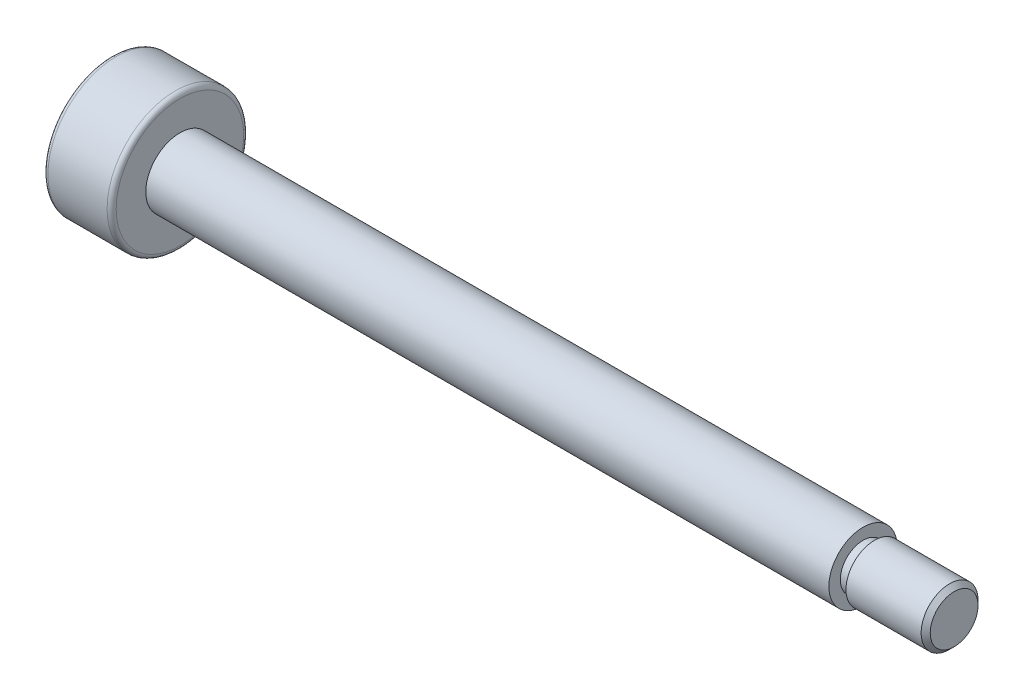
ISO-10303-21;
HEADER;
FILE_DESCRIPTION(('STEP AP214'),'2;1');
FILE_NAME('part.step','',(''),(''),'','','');
FILE_SCHEMA(('AUTOMOTIVE_DESIGN { 1 0 10303 214 1 1 1 1 }'));
ENDSEC;
DATA;
#1=APPLICATION_CONTEXT('core data for automotive mechanical design processes');
#2=APPLICATION_PROTOCOL_DEFINITION('international standard','automotive_design',2000,#1);
#3=PRODUCT_CONTEXT('',#1,'mechanical');
#4=PRODUCT('Part','Part','',(#3));
#5=PRODUCT_RELATED_PRODUCT_CATEGORY('part','',(#4));
#6=PRODUCT_DEFINITION_FORMATION('','',#4);
#7=PRODUCT_DEFINITION_CONTEXT('part definition',#1,'design');
#8=PRODUCT_DEFINITION('design','',#6,#7);
#9=PRODUCT_DEFINITION_SHAPE('','',#8);
#10=(LENGTH_UNIT() NAMED_UNIT(*) SI_UNIT(.MILLI.,.METRE.));
#11=(NAMED_UNIT(*) PLANE_ANGLE_UNIT() SI_UNIT($,.RADIAN.));
#12=(NAMED_UNIT(*) SI_UNIT($,.STERADIAN.) SOLID_ANGLE_UNIT());
#13=UNCERTAINTY_MEASURE_WITH_UNIT(LENGTH_MEASURE(1.E-05),#10,'distance_accuracy_value','');
#14=(GEOMETRIC_REPRESENTATION_CONTEXT(3) GLOBAL_UNCERTAINTY_ASSIGNED_CONTEXT((#13)) GLOBAL_UNIT_ASSIGNED_CONTEXT((#10,
#11,#12)) REPRESENTATION_CONTEXT('',''));
#15=CARTESIAN_POINT('',(0.,0.,0.));
#16=DIRECTION('',(0.,0.,1.));
#17=DIRECTION('',(1.,0.,0.));
#18=AXIS2_PLACEMENT_3D('',#15,#16,#17);
#19=CARTESIAN_POINT('',(-18.5,0.,0.));
#20=DIRECTION('',(1.,0.,0.));
#21=DIRECTION('',(0.,0.,-1.));
#22=AXIS2_PLACEMENT_3D('',#19,#20,#21);
#23=PLANE('',#22);
#24=DIRECTION('',(0.,0.866025403784438,-0.5));
#25=VECTOR('',#24,1.);
#26=CARTESIAN_POINT('',(-18.5,0.,1.73205080756888));
#27=LINE('',#26,#25);
#28=CARTESIAN_POINT('',(-18.5,0.,1.73205080756888));
#29=VERTEX_POINT('',#28);
#30=CARTESIAN_POINT('',(-18.5,1.5,0.866025403784438));
#31=VERTEX_POINT('',#30);
#32=EDGE_CURVE('E127',#29,#31,#27,.T.);
#33=ORIENTED_EDGE('',*,*,#32,.F.);
#34=DIRECTION('',(0.,0.866025403784439,0.5));
#35=VECTOR('',#34,1.);
#36=CARTESIAN_POINT('',(-18.5,-1.5,0.866025403784438));
#37=LINE('',#36,#35);
#38=CARTESIAN_POINT('',(-18.5,-1.5,0.866025403784438));
#39=VERTEX_POINT('',#38);
#40=EDGE_CURVE('E53',#39,#29,#37,.T.);
#41=ORIENTED_EDGE('',*,*,#40,.F.);
#42=DIRECTION('',(0.,0.,1.));
#43=VECTOR('',#42,1.);
#44=CARTESIAN_POINT('',(-18.5,-1.5,-0.866025403784438));
#45=LINE('',#44,#43);
#46=CARTESIAN_POINT('',(-18.5,-1.5,-0.866025403784438));
#47=VERTEX_POINT('',#46);
#48=EDGE_CURVE('E136',#47,#39,#45,.T.);
#49=ORIENTED_EDGE('',*,*,#48,.F.);
#50=DIRECTION('',(0.,-0.866025403784438,0.5));
#51=VECTOR('',#50,1.);
#52=CARTESIAN_POINT('',(-18.5,0.,-1.73205080756888));
#53=LINE('',#52,#51);
#54=CARTESIAN_POINT('',(-18.5,0.,-1.73205080756888));
#55=VERTEX_POINT('',#54);
#56=EDGE_CURVE('E134',#55,#47,#53,.T.);
#57=ORIENTED_EDGE('',*,*,#56,.F.);
#58=DIRECTION('',(0.,-0.866025403784439,-0.5));
#59=VECTOR('',#58,1.);
#60=CARTESIAN_POINT('',(-18.5,1.5,-0.866025403784438));
#61=LINE('',#60,#59);
#62=CARTESIAN_POINT('',(-18.5,1.5,-0.866025403784438));
#63=VERTEX_POINT('',#62);
#64=EDGE_CURVE('E101',#63,#55,#61,.T.);
#65=ORIENTED_EDGE('',*,*,#64,.F.);
#66=DIRECTION('',(0.,0.,-1.));
#67=VECTOR('',#66,1.);
#68=CARTESIAN_POINT('',(-18.5,1.5,0.866025403784438));
#69=LINE('',#68,#67);
#70=EDGE_CURVE('E130',#31,#63,#69,.T.);
#71=ORIENTED_EDGE('',*,*,#70,.F.);
#72=EDGE_LOOP('',(#33,#41,#49,#57,#65,#71));
#73=FACE_BOUND('',#72,.T.);
#74=CARTESIAN_POINT('',(-18.5,0.,0.));
#75=DIRECTION('',(1.,0.,0.));
#76=DIRECTION('',(0.,0.,-1.));
#77=AXIS2_PLACEMENT_3D('',#74,#75,#76);
#78=CIRCLE('',#77,2.8);
#79=CARTESIAN_POINT('',(-18.5,0.,-2.8));
#80=VERTEX_POINT('',#79);
#81=EDGE_CURVE('E169',#80,#80,#78,.F.);
#82=ORIENTED_EDGE('',*,*,#81,.T.);
#83=EDGE_LOOP('',(#82));
#84=FACE_BOUND('',#83,.T.);
#85=ADVANCED_FACE('F37',(#73,#84),#23,.F.);
#86=CARTESIAN_POINT('',(-18.5,0.,0.));
#87=DIRECTION('',(-1.,0.,0.));
#88=DIRECTION('',(0.,0.,1.));
#89=AXIS2_PLACEMENT_3D('',#86,#87,#88);
#90=CYLINDRICAL_SURFACE('',#89,3.);
#91=CARTESIAN_POINT('',(-15.7,0.,0.));
#92=DIRECTION('',(-1.,0.,0.));
#93=DIRECTION('',(0.,0.,1.));
#94=AXIS2_PLACEMENT_3D('',#91,#92,#93);
#95=CIRCLE('',#94,3.);
#96=CARTESIAN_POINT('',(-15.7,0.,3.));
#97=VERTEX_POINT('',#96);
#98=EDGE_CURVE('E163',#97,#97,#95,.T.);
#99=ORIENTED_EDGE('',*,*,#98,.T.);
#100=EDGE_LOOP('',(#99));
#101=FACE_BOUND('',#100,.T.);
#102=CARTESIAN_POINT('',(-18.3,0.,0.));
#103=DIRECTION('',(1.,0.,0.));
#104=DIRECTION('',(0.,0.,-1.));
#105=AXIS2_PLACEMENT_3D('',#102,#103,#104);
#106=CIRCLE('',#105,3.);
#107=CARTESIAN_POINT('',(-18.3,0.,-3.));
#108=VERTEX_POINT('',#107);
#109=EDGE_CURVE('E160',#108,#108,#106,.T.);
#110=ORIENTED_EDGE('',*,*,#109,.T.);
#111=EDGE_LOOP('',(#110));
#112=FACE_BOUND('',#111,.T.);
#113=ADVANCED_FACE('F191',(#101,#112),#90,.T.);
#114=CARTESIAN_POINT('',(-15.5,3.,0.));
#115=DIRECTION('',(-1.,0.,0.));
#116=DIRECTION('',(0.,0.,1.));
#117=AXIS2_PLACEMENT_3D('',#114,#115,#116);
#118=PLANE('',#117);
#119=CARTESIAN_POINT('',(-15.5,0.,0.));
#120=DIRECTION('',(-1.,0.,0.));
#121=DIRECTION('',(0.,0.,1.));
#122=AXIS2_PLACEMENT_3D('',#119,#120,#121);
#123=CIRCLE('',#122,2.8);
#124=CARTESIAN_POINT('',(-15.5,0.,2.8));
#125=VERTEX_POINT('',#124);
#126=EDGE_CURVE('E166',#125,#125,#123,.F.);
#127=ORIENTED_EDGE('',*,*,#126,.T.);
#128=EDGE_LOOP('',(#127));
#129=FACE_BOUND('',#128,.T.);
#130=CARTESIAN_POINT('',(-15.5,0.,0.));
#131=DIRECTION('',(-1.,0.,0.));
#132=DIRECTION('',(0.,0.,1.));
#133=AXIS2_PLACEMENT_3D('',#130,#131,#132);
#134=CIRCLE('',#133,1.5);
#135=CARTESIAN_POINT('',(-15.5,0.,1.5));
#136=VERTEX_POINT('',#135);
#137=EDGE_CURVE('E157',#136,#136,#134,.T.);
#138=ORIENTED_EDGE('',*,*,#137,.T.);
#139=EDGE_LOOP('',(#138));
#140=FACE_BOUND('',#139,.T.);
#141=ADVANCED_FACE('F197',(#129,#140),#118,.F.);
#142=CARTESIAN_POINT('',(-18.5,0.,0.));
#143=DIRECTION('',(-1.,0.,0.));
#144=DIRECTION('',(0.,0.,1.));
#145=AXIS2_PLACEMENT_3D('',#142,#143,#144);
#146=CYLINDRICAL_SURFACE('',#145,1.5);
#147=ORIENTED_EDGE('',*,*,#137,.F.);
#148=EDGE_LOOP('',(#147));
#149=FACE_BOUND('',#148,.T.);
#150=CARTESIAN_POINT('',(14.5,0.,0.));
#151=DIRECTION('',(-1.,0.,0.));
#152=DIRECTION('',(0.,0.,1.));
#153=AXIS2_PLACEMENT_3D('',#150,#151,#152);
#154=CIRCLE('',#153,1.5);
#155=CARTESIAN_POINT('',(14.5,0.,1.5));
#156=VERTEX_POINT('',#155);
#157=EDGE_CURVE('E154',#156,#156,#154,.T.);
#158=ORIENTED_EDGE('',*,*,#157,.T.);
#159=EDGE_LOOP('',(#158));
#160=FACE_BOUND('',#159,.T.);
#161=ADVANCED_FACE('F231',(#149,#160),#146,.T.);
#162=CARTESIAN_POINT('',(14.5,1.5,0.));
#163=DIRECTION('',(-1.,0.,0.));
#164=DIRECTION('',(0.,0.,1.));
#165=AXIS2_PLACEMENT_3D('',#162,#163,#164);
#166=PLANE('',#165);
#167=ORIENTED_EDGE('',*,*,#157,.F.);
#168=EDGE_LOOP('',(#167));
#169=FACE_BOUND('',#168,.T.);
#170=CARTESIAN_POINT('',(14.5,0.,0.));
#171=DIRECTION('',(-1.,0.,0.));
#172=DIRECTION('',(0.,0.,1.));
#173=AXIS2_PLACEMENT_3D('',#170,#171,#172);
#174=CIRCLE('',#173,1.);
#175=CARTESIAN_POINT('',(14.5,0.,1.));
#176=VERTEX_POINT('',#175);
#177=EDGE_CURVE('E151',#176,#176,#174,.T.);
#178=ORIENTED_EDGE('',*,*,#177,.T.);
#179=EDGE_LOOP('',(#178));
#180=FACE_BOUND('',#179,.T.);
#181=ADVANCED_FACE('F207',(#169,#180),#166,.F.);
#182=CARTESIAN_POINT('',(-15.7,0.,0.));
#183=DIRECTION('',(-1.,0.,0.));
#184=DIRECTION('',(0.,0.,1.));
#185=AXIS2_PLACEMENT_3D('',#182,#183,#184);
#186=TOROIDAL_SURFACE('',#185,2.8,0.2);
#187=ORIENTED_EDGE('',*,*,#126,.F.);
#188=EDGE_LOOP('',(#187));
#189=FACE_BOUND('',#188,.T.);
#190=ORIENTED_EDGE('',*,*,#98,.F.);
#191=EDGE_LOOP('',(#190));
#192=FACE_BOUND('',#191,.T.);
#193=ADVANCED_FACE('F204',(#189,#192),#186,.T.);
#194=CARTESIAN_POINT('',(-18.3,0.,0.));
#195=DIRECTION('',(1.,0.,0.));
#196=DIRECTION('',(0.,0.,-1.));
#197=AXIS2_PLACEMENT_3D('',#194,#195,#196);
#198=TOROIDAL_SURFACE('',#197,2.8,0.2);
#199=ORIENTED_EDGE('',*,*,#109,.F.);
#200=EDGE_LOOP('',(#199));
#201=FACE_BOUND('',#200,.T.);
#202=ORIENTED_EDGE('',*,*,#81,.F.);
#203=EDGE_LOOP('',(#202));
#204=FACE_BOUND('',#203,.T.);
#205=ADVANCED_FACE('F206',(#201,#204),#198,.T.);
#206=CARTESIAN_POINT('',(14.5,0.,0.));
#207=DIRECTION('',(-1.,0.,0.));
#208=DIRECTION('',(0.,0.,1.));
#209=AXIS2_PLACEMENT_3D('',#206,#207,#208);
#210=CYLINDRICAL_SURFACE('',#209,1.);
#211=CARTESIAN_POINT('',(15.,0.,0.));
#212=DIRECTION('',(-1.,0.,0.));
#213=DIRECTION('',(0.,0.,1.));
#214=AXIS2_PLACEMENT_3D('',#211,#212,#213);
#215=CIRCLE('',#214,1.);
#216=CARTESIAN_POINT('',(15.,0.,1.));
#217=VERTEX_POINT('',#216);
#218=EDGE_CURVE('E148',#217,#217,#215,.T.);
#219=ORIENTED_EDGE('',*,*,#218,.T.);
#220=EDGE_LOOP('',(#219));
#221=FACE_BOUND('',#220,.T.);
#222=ORIENTED_EDGE('',*,*,#177,.F.);
#223=EDGE_LOOP('',(#222));
#224=FACE_BOUND('',#223,.T.);
#225=ADVANCED_FACE('F210',(#221,#224),#210,.T.);
#226=CARTESIAN_POINT('',(15.,1.25,0.));
#227=DIRECTION('',(-1.,0.,0.));
#228=DIRECTION('',(0.,0.,1.));
#229=AXIS2_PLACEMENT_3D('',#226,#227,#228);
#230=PLANE('',#229);
#231=CARTESIAN_POINT('',(15.,0.,0.));
#232=DIRECTION('',(-1.,0.,0.));
#233=DIRECTION('',(0.,0.,1.));
#234=AXIS2_PLACEMENT_3D('',#231,#232,#233);
#235=CIRCLE('',#234,1.25);
#236=CARTESIAN_POINT('',(15.,0.,1.25));
#237=VERTEX_POINT('',#236);
#238=EDGE_CURVE('E140',#237,#237,#235,.T.);
#239=ORIENTED_EDGE('',*,*,#238,.T.);
#240=EDGE_LOOP('',(#239));
#241=FACE_BOUND('',#240,.T.);
#242=ORIENTED_EDGE('',*,*,#218,.F.);
#243=EDGE_LOOP('',(#242));
#244=FACE_BOUND('',#243,.T.);
#245=ADVANCED_FACE('F186',(#241,#244),#230,.T.);
#246=CARTESIAN_POINT('',(18.5,1.25,0.));
#247=DIRECTION('',(-1.,0.,0.));
#248=DIRECTION('',(0.,0.,1.));
#249=AXIS2_PLACEMENT_3D('',#246,#247,#248);
#250=PLANE('',#249);
#251=CARTESIAN_POINT('',(18.5,0.,0.));
#252=DIRECTION('',(-1.,0.,0.));
#253=DIRECTION('',(0.,0.,1.));
#254=AXIS2_PLACEMENT_3D('',#251,#252,#253);
#255=CIRCLE('',#254,1.05);
#256=CARTESIAN_POINT('',(18.5,0.,1.05));
#257=VERTEX_POINT('',#256);
#258=EDGE_CURVE('E11',#257,#257,#255,.F.);
#259=ORIENTED_EDGE('',*,*,#258,.T.);
#260=EDGE_LOOP('',(#259));
#261=FACE_BOUND('',#260,.T.);
#262=ADVANCED_FACE('F178',(#261),#250,.F.);
#263=CARTESIAN_POINT('',(18.3,0.,0.));
#264=DIRECTION('',(-1.,0.,0.));
#265=DIRECTION('',(0.,0.,1.));
#266=AXIS2_PLACEMENT_3D('',#263,#264,#265);
#267=CONICAL_SURFACE('',#266,1.25,0.785398163397445);
#268=ORIENTED_EDGE('',*,*,#258,.F.);
#269=EDGE_LOOP('',(#268));
#270=FACE_BOUND('',#269,.T.);
#271=CARTESIAN_POINT('',(18.3,0.,0.));
#272=DIRECTION('',(-1.,0.,0.));
#273=DIRECTION('',(0.,0.,1.));
#274=AXIS2_PLACEMENT_3D('',#271,#272,#273);
#275=CIRCLE('',#274,1.25);
#276=CARTESIAN_POINT('',(18.3,0.,1.25));
#277=VERTEX_POINT('',#276);
#278=EDGE_CURVE('E46',#277,#277,#275,.T.);
#279=ORIENTED_EDGE('',*,*,#278,.F.);
#280=EDGE_LOOP('',(#279));
#281=FACE_BOUND('',#280,.T.);
#282=ADVANCED_FACE('F40',(#270,#281),#267,.T.);
#283=CARTESIAN_POINT('',(-18.5,0.,0.));
#284=DIRECTION('',(-1.,0.,0.));
#285=DIRECTION('',(0.,0.,1.));
#286=AXIS2_PLACEMENT_3D('',#283,#284,#285);
#287=CYLINDRICAL_SURFACE('',#286,1.25);
#288=ORIENTED_EDGE('',*,*,#278,.T.);
#289=EDGE_LOOP('',(#288));
#290=FACE_BOUND('',#289,.T.);
#291=ORIENTED_EDGE('',*,*,#238,.F.);
#292=EDGE_LOOP('',(#291));
#293=FACE_BOUND('',#292,.T.);
#294=ADVANCED_FACE('F174',(#290,#293),#287,.T.);
#295=CARTESIAN_POINT('',(-16.5,-1.5,0.866025403784438));
#296=DIRECTION('',(0.,-0.5,0.866025403784439));
#297=DIRECTION('',(0.,-0.866025403784439,-0.5));
#298=AXIS2_PLACEMENT_3D('',#295,#296,#297);
#299=PLANE('',#298);
#300=ORIENTED_EDGE('',*,*,#40,.T.);
#301=DIRECTION('',(-1.,0.,0.));
#302=VECTOR('',#301,1.);
#303=CARTESIAN_POINT('',(-16.5,0.,1.73205080756888));
#304=LINE('',#303,#302);
#305=CARTESIAN_POINT('',(-16.5,0.,1.73205080756888));
#306=VERTEX_POINT('',#305);
#307=EDGE_CURVE('E83',#306,#29,#304,.T.);
#308=ORIENTED_EDGE('',*,*,#307,.F.);
#309=DIRECTION('',(0.,0.866025403784439,0.5));
#310=VECTOR('',#309,1.);
#311=CARTESIAN_POINT('',(-16.5,-1.5,0.866025403784438));
#312=LINE('',#311,#310);
#313=CARTESIAN_POINT('',(-16.5,-1.5,0.866025403784438));
#314=VERTEX_POINT('',#313);
#315=EDGE_CURVE('E138',#314,#306,#312,.T.);
#316=ORIENTED_EDGE('',*,*,#315,.F.);
#317=DIRECTION('',(-1.,0.,0.));
#318=VECTOR('',#317,1.);
#319=CARTESIAN_POINT('',(-16.5,-1.5,0.866025403784438));
#320=LINE('',#319,#318);
#321=EDGE_CURVE('E61',#314,#39,#320,.T.);
#322=ORIENTED_EDGE('',*,*,#321,.T.);
#323=EDGE_LOOP('',(#300,#308,#316,#322));
#324=FACE_BOUND('',#323,.T.);
#325=ADVANCED_FACE('F184',(#324),#299,.F.);
#326=CARTESIAN_POINT('',(-16.5,-1.5,-0.866025403784438));
#327=DIRECTION('',(0.,-1.,0.));
#328=DIRECTION('',(0.,0.,-1.));
#329=AXIS2_PLACEMENT_3D('',#326,#327,#328);
#330=PLANE('',#329);
#331=ORIENTED_EDGE('',*,*,#48,.T.);
#332=ORIENTED_EDGE('',*,*,#321,.F.);
#333=DIRECTION('',(0.,0.,1.));
#334=VECTOR('',#333,1.);
#335=CARTESIAN_POINT('',(-16.5,-1.5,-0.866025403784438));
#336=LINE('',#335,#334);
#337=CARTESIAN_POINT('',(-16.5,-1.5,-0.866025403784438));
#338=VERTEX_POINT('',#337);
#339=EDGE_CURVE('E113',#338,#314,#336,.T.);
#340=ORIENTED_EDGE('',*,*,#339,.F.);
#341=DIRECTION('',(-1.,0.,0.));
#342=VECTOR('',#341,1.);
#343=CARTESIAN_POINT('',(-16.5,-1.5,-0.866025403784438));
#344=LINE('',#343,#342);
#345=EDGE_CURVE('E105',#338,#47,#344,.T.);
#346=ORIENTED_EDGE('',*,*,#345,.T.);
#347=EDGE_LOOP('',(#331,#332,#340,#346));
#348=FACE_BOUND('',#347,.T.);
#349=ADVANCED_FACE('F305',(#348),#330,.F.);
#350=CARTESIAN_POINT('',(-16.5,0.,-1.73205080756888));
#351=DIRECTION('',(0.,-0.5,-0.866025403784438));
#352=DIRECTION('',(0.,0.866025403784439,-0.5));
#353=AXIS2_PLACEMENT_3D('',#350,#351,#352);
#354=PLANE('',#353);
#355=ORIENTED_EDGE('',*,*,#56,.T.);
#356=ORIENTED_EDGE('',*,*,#345,.F.);
#357=DIRECTION('',(0.,-0.866025403784438,0.5));
#358=VECTOR('',#357,1.);
#359=CARTESIAN_POINT('',(-16.5,0.,-1.73205080756888));
#360=LINE('',#359,#358);
#361=CARTESIAN_POINT('',(-16.5,0.,-1.73205080756888));
#362=VERTEX_POINT('',#361);
#363=EDGE_CURVE('E109',#362,#338,#360,.T.);
#364=ORIENTED_EDGE('',*,*,#363,.F.);
#365=DIRECTION('',(-1.,0.,0.));
#366=VECTOR('',#365,1.);
#367=CARTESIAN_POINT('',(-16.5,0.,-1.73205080756888));
#368=LINE('',#367,#366);
#369=EDGE_CURVE('E94',#362,#55,#368,.T.);
#370=ORIENTED_EDGE('',*,*,#369,.T.);
#371=EDGE_LOOP('',(#355,#356,#364,#370));
#372=FACE_BOUND('',#371,.T.);
#373=ADVANCED_FACE('F110',(#372),#354,.F.);
#374=CARTESIAN_POINT('',(-16.5,1.5,-0.866025403784438));
#375=DIRECTION('',(0.,0.5,-0.866025403784439));
#376=DIRECTION('',(0.,0.866025403784439,0.5));
#377=AXIS2_PLACEMENT_3D('',#374,#375,#376);
#378=PLANE('',#377);
#379=ORIENTED_EDGE('',*,*,#64,.T.);
#380=ORIENTED_EDGE('',*,*,#369,.F.);
#381=DIRECTION('',(0.,-0.866025403784439,-0.5));
#382=VECTOR('',#381,1.);
#383=CARTESIAN_POINT('',(-16.5,1.5,-0.866025403784438));
#384=LINE('',#383,#382);
#385=CARTESIAN_POINT('',(-16.5,1.5,-0.866025403784438));
#386=VERTEX_POINT('',#385);
#387=EDGE_CURVE('E98',#386,#362,#384,.T.);
#388=ORIENTED_EDGE('',*,*,#387,.F.);
#389=DIRECTION('',(-1.,0.,0.));
#390=VECTOR('',#389,1.);
#391=CARTESIAN_POINT('',(-16.5,1.5,-0.866025403784438));
#392=LINE('',#391,#390);
#393=EDGE_CURVE('E106',#386,#63,#392,.T.);
#394=ORIENTED_EDGE('',*,*,#393,.T.);
#395=EDGE_LOOP('',(#379,#380,#388,#394));
#396=FACE_BOUND('',#395,.T.);
#397=ADVANCED_FACE('F96',(#396),#378,.F.);
#398=CARTESIAN_POINT('',(-16.5,1.5,0.866025403784438));
#399=DIRECTION('',(0.,1.,0.));
#400=DIRECTION('',(0.,0.,1.));
#401=AXIS2_PLACEMENT_3D('',#398,#399,#400);
#402=PLANE('',#401);
#403=ORIENTED_EDGE('',*,*,#70,.T.);
#404=ORIENTED_EDGE('',*,*,#393,.F.);
#405=DIRECTION('',(0.,0.,-1.));
#406=VECTOR('',#405,1.);
#407=CARTESIAN_POINT('',(-16.5,1.5,0.866025403784438));
#408=LINE('',#407,#406);
#409=CARTESIAN_POINT('',(-16.5,1.5,0.866025403784438));
#410=VERTEX_POINT('',#409);
#411=EDGE_CURVE('E119',#410,#386,#408,.T.);
#412=ORIENTED_EDGE('',*,*,#411,.F.);
#413=DIRECTION('',(-1.,0.,0.));
#414=VECTOR('',#413,1.);
#415=CARTESIAN_POINT('',(-16.5,1.5,0.866025403784438));
#416=LINE('',#415,#414);
#417=EDGE_CURVE('E143',#410,#31,#416,.T.);
#418=ORIENTED_EDGE('',*,*,#417,.T.);
#419=EDGE_LOOP('',(#403,#404,#412,#418));
#420=FACE_BOUND('',#419,.T.);
#421=ADVANCED_FACE('F326',(#420),#402,.F.);
#422=CARTESIAN_POINT('',(-16.5,0.,1.73205080756888));
#423=DIRECTION('',(0.,0.5,0.866025403784438));
#424=DIRECTION('',(0.,-0.866025403784439,0.5));
#425=AXIS2_PLACEMENT_3D('',#422,#423,#424);
#426=PLANE('',#425);
#427=ORIENTED_EDGE('',*,*,#32,.T.);
#428=ORIENTED_EDGE('',*,*,#417,.F.);
#429=DIRECTION('',(0.,0.866025403784438,-0.5));
#430=VECTOR('',#429,1.);
#431=CARTESIAN_POINT('',(-16.5,0.,1.73205080756888));
#432=LINE('',#431,#430);
#433=EDGE_CURVE('E121',#306,#410,#432,.T.);
#434=ORIENTED_EDGE('',*,*,#433,.F.);
#435=ORIENTED_EDGE('',*,*,#307,.T.);
#436=EDGE_LOOP('',(#427,#428,#434,#435));
#437=FACE_BOUND('',#436,.T.);
#438=ADVANCED_FACE('F334',(#437),#426,.F.);
#439=CARTESIAN_POINT('',(-16.5,0.,0.));
#440=DIRECTION('',(-1.,0.,0.));
#441=DIRECTION('',(0.,0.,1.));
#442=AXIS2_PLACEMENT_3D('',#439,#440,#441);
#443=PLANE('',#442);
#444=ORIENTED_EDGE('',*,*,#315,.T.);
#445=ORIENTED_EDGE('',*,*,#433,.T.);
#446=ORIENTED_EDGE('',*,*,#411,.T.);
#447=ORIENTED_EDGE('',*,*,#387,.T.);
#448=ORIENTED_EDGE('',*,*,#363,.T.);
#449=ORIENTED_EDGE('',*,*,#339,.T.);
#450=EDGE_LOOP('',(#444,#445,#446,#447,#448,#449));
#451=FACE_BOUND('',#450,.T.);
#452=ADVANCED_FACE('F116',(#451),#443,.T.);
#453=CLOSED_SHELL('',(#85,#113,#141,#161,#181,#193,#205,#225,#245,#262,#282,#294,#325,#349,#373,
#397,#421,#438,#452));
#454=MANIFOLD_SOLID_BREP('B2',#453);
#455=ADVANCED_BREP_SHAPE_REPRESENTATION('',(#18,#454),#14);
#456=SHAPE_DEFINITION_REPRESENTATION(#9,#455);
ENDSEC;
END-ISO-10303-21;
